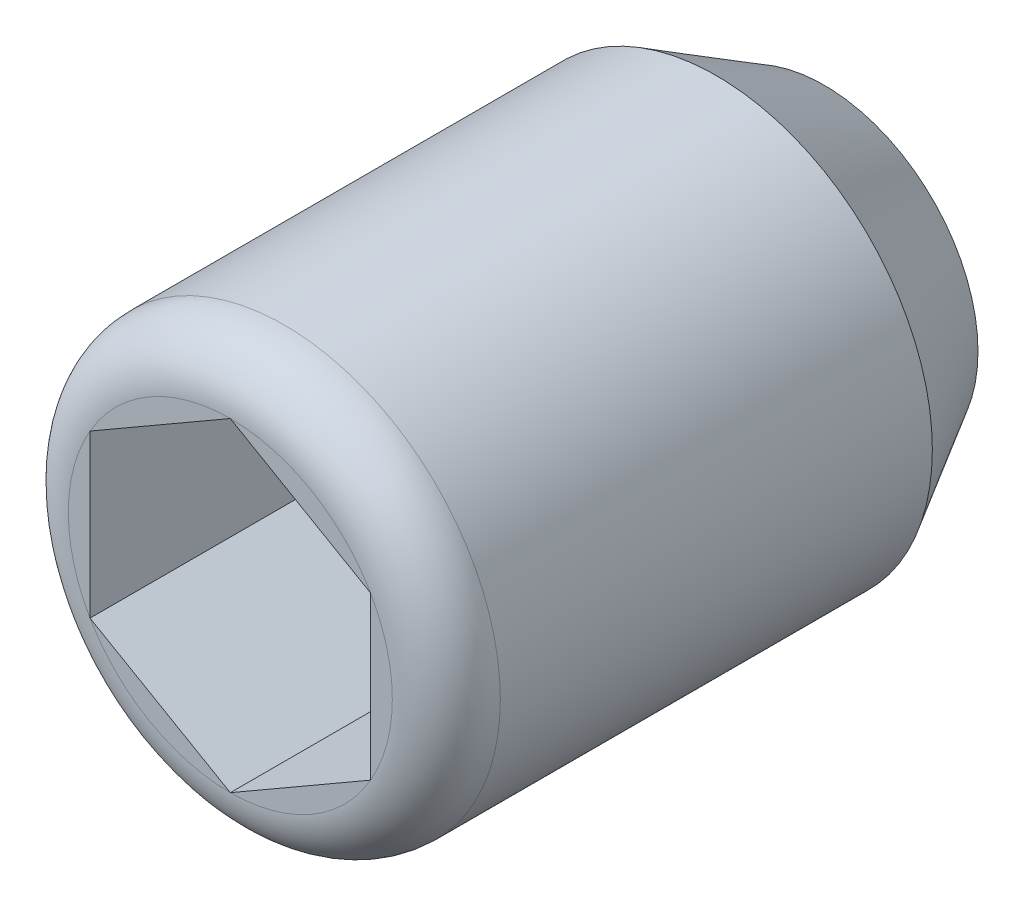
ISO-10303-21;
HEADER;
FILE_DESCRIPTION(('STEP AP214'),'2;1');
FILE_NAME('part.step','',(''),(''),'','','');
FILE_SCHEMA(('AUTOMOTIVE_DESIGN { 1 0 10303 214 1 1 1 1 }'));
ENDSEC;
DATA;
#1=APPLICATION_CONTEXT('core data for automotive mechanical design processes');
#2=APPLICATION_PROTOCOL_DEFINITION('international standard','automotive_design',2000,#1);
#3=PRODUCT_CONTEXT('',#1,'mechanical');
#4=PRODUCT('Part','Part','',(#3));
#5=PRODUCT_RELATED_PRODUCT_CATEGORY('part','',(#4));
#6=PRODUCT_DEFINITION_FORMATION('','',#4);
#7=PRODUCT_DEFINITION_CONTEXT('part definition',#1,'design');
#8=PRODUCT_DEFINITION('design','',#6,#7);
#9=PRODUCT_DEFINITION_SHAPE('','',#8);
#10=(LENGTH_UNIT() NAMED_UNIT(*) SI_UNIT(.MILLI.,.METRE.));
#11=(NAMED_UNIT(*) PLANE_ANGLE_UNIT() SI_UNIT($,.RADIAN.));
#12=(NAMED_UNIT(*) SI_UNIT($,.STERADIAN.) SOLID_ANGLE_UNIT());
#13=UNCERTAINTY_MEASURE_WITH_UNIT(LENGTH_MEASURE(1.E-05),#10,'distance_accuracy_value','');
#14=(GEOMETRIC_REPRESENTATION_CONTEXT(3) GLOBAL_UNCERTAINTY_ASSIGNED_CONTEXT((#13)) GLOBAL_UNIT_ASSIGNED_CONTEXT((#10,
#11,#12)) REPRESENTATION_CONTEXT('',''));
#15=CARTESIAN_POINT('',(0.,0.,0.));
#16=DIRECTION('',(0.,0.,1.));
#17=DIRECTION('',(1.,0.,0.));
#18=AXIS2_PLACEMENT_3D('',#15,#16,#17);
#19=CARTESIAN_POINT('',(0.,0.,5.5));
#20=DIRECTION('',(0.,0.,-1.));
#21=DIRECTION('',(0.,-1.,0.));
#22=AXIS2_PLACEMENT_3D('',#19,#20,#21);
#23=PLANE('',#22);
#24=DIRECTION('',(-0.866025403784439,0.5,0.));
#25=VECTOR('',#24,1.);
#26=CARTESIAN_POINT('',(1.29903810567666,0.75,5.5));
#27=LINE('',#26,#25);
#28=CARTESIAN_POINT('',(1.29903810567666,0.75,5.5));
#29=VERTEX_POINT('',#28);
#30=CARTESIAN_POINT('',(0.,1.5,5.5));
#31=VERTEX_POINT('',#30);
#32=EDGE_CURVE('E40',#29,#31,#27,.T.);
#33=ORIENTED_EDGE('',*,*,#32,.F.);
#34=CARTESIAN_POINT('',(0.,0.,5.5));
#35=DIRECTION('',(0.,0.,1.));
#36=DIRECTION('',(-1.,0.,0.));
#37=AXIS2_PLACEMENT_3D('',#34,#35,#36);
#38=CIRCLE('',#37,1.5);
#39=EDGE_CURVE('E11',#29,#31,#38,.T.);
#40=ORIENTED_EDGE('',*,*,#39,.T.);
#41=EDGE_LOOP('',(#33,#40));
#42=FACE_BOUND('',#41,.T.);
#43=ADVANCED_FACE('F17',(#42),#23,.F.);
#44=CARTESIAN_POINT('',(0.,0.,5.5));
#45=DIRECTION('',(0.,0.,-1.));
#46=DIRECTION('',(0.,-1.,0.));
#47=AXIS2_PLACEMENT_3D('',#44,#45,#46);
#48=PLANE('',#47);
#49=DIRECTION('',(-0.866025403784438,-0.5,0.));
#50=VECTOR('',#49,1.);
#51=CARTESIAN_POINT('',(0.,1.5,5.5));
#52=LINE('',#51,#50);
#53=CARTESIAN_POINT('',(-1.29903810567665,0.75,5.5));
#54=VERTEX_POINT('',#53);
#55=EDGE_CURVE('E141',#31,#54,#52,.T.);
#56=ORIENTED_EDGE('',*,*,#55,.F.);
#57=CARTESIAN_POINT('',(0.,0.,5.5));
#58=DIRECTION('',(0.,0.,1.));
#59=DIRECTION('',(-1.,0.,0.));
#60=AXIS2_PLACEMENT_3D('',#57,#58,#59);
#61=CIRCLE('',#60,1.5);
#62=EDGE_CURVE('E28',#31,#54,#61,.T.);
#63=ORIENTED_EDGE('',*,*,#62,.T.);
#64=EDGE_LOOP('',(#56,#63));
#65=FACE_BOUND('',#64,.T.);
#66=ADVANCED_FACE('F216',(#65),#48,.F.);
#67=CARTESIAN_POINT('',(0.,0.,5.5));
#68=DIRECTION('',(0.,0.,-1.));
#69=DIRECTION('',(0.,-1.,0.));
#70=AXIS2_PLACEMENT_3D('',#67,#68,#69);
#71=PLANE('',#70);
#72=DIRECTION('',(0.,-1.,0.));
#73=VECTOR('',#72,1.);
#74=CARTESIAN_POINT('',(-1.29903810567665,0.75,5.5));
#75=LINE('',#74,#73);
#76=CARTESIAN_POINT('',(-1.29903810567665,-0.75,5.5));
#77=VERTEX_POINT('',#76);
#78=EDGE_CURVE('E142',#54,#77,#75,.T.);
#79=ORIENTED_EDGE('',*,*,#78,.F.);
#80=CARTESIAN_POINT('',(0.,0.,5.5));
#81=DIRECTION('',(0.,0.,1.));
#82=DIRECTION('',(-1.,0.,0.));
#83=AXIS2_PLACEMENT_3D('',#80,#81,#82);
#84=CIRCLE('',#83,1.5);
#85=EDGE_CURVE('E168',#54,#77,#84,.T.);
#86=ORIENTED_EDGE('',*,*,#85,.T.);
#87=EDGE_LOOP('',(#79,#86));
#88=FACE_BOUND('',#87,.T.);
#89=ADVANCED_FACE('F222',(#88),#71,.F.);
#90=CARTESIAN_POINT('',(0.,0.,5.5));
#91=DIRECTION('',(0.,0.,-1.));
#92=DIRECTION('',(0.,-1.,0.));
#93=AXIS2_PLACEMENT_3D('',#90,#91,#92);
#94=PLANE('',#93);
#95=DIRECTION('',(0.866025403784439,-0.5,0.));
#96=VECTOR('',#95,1.);
#97=CARTESIAN_POINT('',(-1.29903810567665,-0.75,5.5));
#98=LINE('',#97,#96);
#99=CARTESIAN_POINT('',(0.,-1.5,5.5));
#100=VERTEX_POINT('',#99);
#101=EDGE_CURVE('E79',#77,#100,#98,.T.);
#102=ORIENTED_EDGE('',*,*,#101,.F.);
#103=CARTESIAN_POINT('',(0.,0.,5.5));
#104=DIRECTION('',(0.,0.,1.));
#105=DIRECTION('',(-1.,0.,0.));
#106=AXIS2_PLACEMENT_3D('',#103,#104,#105);
#107=CIRCLE('',#106,1.5);
#108=EDGE_CURVE('E147',#77,#100,#107,.T.);
#109=ORIENTED_EDGE('',*,*,#108,.T.);
#110=EDGE_LOOP('',(#102,#109));
#111=FACE_BOUND('',#110,.T.);
#112=ADVANCED_FACE('F301',(#111),#94,.F.);
#113=CARTESIAN_POINT('',(0.,0.,5.5));
#114=DIRECTION('',(0.,0.,-1.));
#115=DIRECTION('',(0.,-1.,0.));
#116=AXIS2_PLACEMENT_3D('',#113,#114,#115);
#117=PLANE('',#116);
#118=DIRECTION('',(0.866025403784438,0.5,0.));
#119=VECTOR('',#118,1.);
#120=CARTESIAN_POINT('',(0.,-1.5,5.5));
#121=LINE('',#120,#119);
#122=CARTESIAN_POINT('',(1.29903810567666,-0.75,5.5));
#123=VERTEX_POINT('',#122);
#124=EDGE_CURVE('E120',#100,#123,#121,.T.);
#125=ORIENTED_EDGE('',*,*,#124,.F.);
#126=CARTESIAN_POINT('',(0.,0.,5.5));
#127=DIRECTION('',(0.,0.,1.));
#128=DIRECTION('',(-1.,0.,0.));
#129=AXIS2_PLACEMENT_3D('',#126,#127,#128);
#130=CIRCLE('',#129,1.5);
#131=EDGE_CURVE('E143',#100,#123,#130,.T.);
#132=ORIENTED_EDGE('',*,*,#131,.T.);
#133=EDGE_LOOP('',(#125,#132));
#134=FACE_BOUND('',#133,.T.);
#135=ADVANCED_FACE('F315',(#134),#117,.F.);
#136=CARTESIAN_POINT('',(0.,0.,5.5));
#137=DIRECTION('',(0.,0.,-1.));
#138=DIRECTION('',(-1.,0.,0.));
#139=AXIS2_PLACEMENT_3D('',#136,#137,#138);
#140=CYLINDRICAL_SURFACE('',#139,2.);
#141=CARTESIAN_POINT('',(0.,0.,5.));
#142=DIRECTION('',(0.,0.,-1.));
#143=DIRECTION('',(-1.,0.,0.));
#144=AXIS2_PLACEMENT_3D('',#141,#142,#143);
#145=CIRCLE('',#144,2.);
#146=CARTESIAN_POINT('',(-2.,0.,5.));
#147=VERTEX_POINT('',#146);
#148=EDGE_CURVE('E148',#147,#147,#145,.T.);
#149=ORIENTED_EDGE('',*,*,#148,.T.);
#150=EDGE_LOOP('',(#149));
#151=FACE_BOUND('',#150,.T.);
#152=CARTESIAN_POINT('',(0.,0.,1.));
#153=DIRECTION('',(0.,0.,1.));
#154=DIRECTION('',(-1.,0.,0.));
#155=AXIS2_PLACEMENT_3D('',#152,#153,#154);
#156=CIRCLE('',#155,2.);
#157=CARTESIAN_POINT('',(-2.,0.,1.));
#158=VERTEX_POINT('',#157);
#159=EDGE_CURVE('E173',#158,#158,#156,.T.);
#160=ORIENTED_EDGE('',*,*,#159,.T.);
#161=EDGE_LOOP('',(#160));
#162=FACE_BOUND('',#161,.T.);
#163=ADVANCED_FACE('F310',(#151,#162),#140,.T.);
#164=CARTESIAN_POINT('',(0.,0.,5.5));
#165=DIRECTION('',(0.,0.,-1.));
#166=DIRECTION('',(0.,-1.,0.));
#167=AXIS2_PLACEMENT_3D('',#164,#165,#166);
#168=PLANE('',#167);
#169=DIRECTION('',(0.,1.,0.));
#170=VECTOR('',#169,1.);
#171=CARTESIAN_POINT('',(1.29903810567666,-0.75,5.5));
#172=LINE('',#171,#170);
#173=EDGE_CURVE('E88',#123,#29,#172,.T.);
#174=ORIENTED_EDGE('',*,*,#173,.F.);
#175=CARTESIAN_POINT('',(0.,0.,5.5));
#176=DIRECTION('',(0.,0.,1.));
#177=DIRECTION('',(-1.,0.,0.));
#178=AXIS2_PLACEMENT_3D('',#175,#176,#177);
#179=CIRCLE('',#178,1.5);
#180=EDGE_CURVE('E170',#123,#29,#179,.T.);
#181=ORIENTED_EDGE('',*,*,#180,.T.);
#182=EDGE_LOOP('',(#174,#181));
#183=FACE_BOUND('',#182,.T.);
#184=ADVANCED_FACE('F253',(#183),#168,.F.);
#185=CARTESIAN_POINT('',(0.,0.,0.));
#186=DIRECTION('',(0.,0.,-1.));
#187=DIRECTION('',(0.,-1.,0.));
#188=AXIS2_PLACEMENT_3D('',#185,#186,#187);
#189=PLANE('',#188);
#190=CARTESIAN_POINT('',(0.,0.,0.));
#191=DIRECTION('',(0.,0.,-1.));
#192=DIRECTION('',(-1.,0.,0.));
#193=AXIS2_PLACEMENT_3D('',#190,#191,#192);
#194=CIRCLE('',#193,1.42264973081037);
#195=CARTESIAN_POINT('',(-1.42264973081037,0.,0.));
#196=VERTEX_POINT('',#195);
#197=EDGE_CURVE('E134',#196,#196,#194,.T.);
#198=ORIENTED_EDGE('',*,*,#197,.T.);
#199=EDGE_LOOP('',(#198));
#200=FACE_BOUND('',#199,.T.);
#201=ADVANCED_FACE('F248',(#200),#189,.T.);
#202=CARTESIAN_POINT('',(0.,0.,0.));
#203=DIRECTION('',(0.,0.,1.));
#204=DIRECTION('',(1.,0.,0.));
#205=AXIS2_PLACEMENT_3D('',#202,#203,#204);
#206=CONICAL_SURFACE('',#205,1.42264973081037,0.523598775598299);
#207=ORIENTED_EDGE('',*,*,#159,.F.);
#208=EDGE_LOOP('',(#207));
#209=FACE_BOUND('',#208,.T.);
#210=ORIENTED_EDGE('',*,*,#197,.F.);
#211=EDGE_LOOP('',(#210));
#212=FACE_BOUND('',#211,.T.);
#213=ADVANCED_FACE('F239',(#209,#212),#206,.T.);
#214=CARTESIAN_POINT('',(0.,-1.5,2.5));
#215=DIRECTION('',(0.5,-0.866025403784438,0.));
#216=DIRECTION('',(0.,0.,-1.));
#217=AXIS2_PLACEMENT_3D('',#214,#215,#216);
#218=PLANE('',#217);
#219=ORIENTED_EDGE('',*,*,#124,.T.);
#220=DIRECTION('',(0.,0.,1.));
#221=VECTOR('',#220,1.);
#222=CARTESIAN_POINT('',(1.29903810567666,-0.75,2.5));
#223=LINE('',#222,#221);
#224=CARTESIAN_POINT('',(1.29903810567666,-0.75,2.5));
#225=VERTEX_POINT('',#224);
#226=EDGE_CURVE('E110',#225,#123,#223,.T.);
#227=ORIENTED_EDGE('',*,*,#226,.F.);
#228=DIRECTION('',(0.866025403784438,0.5,0.));
#229=VECTOR('',#228,1.);
#230=CARTESIAN_POINT('',(0.,-1.5,2.5));
#231=LINE('',#230,#229);
#232=CARTESIAN_POINT('',(0.,-1.5,2.5));
#233=VERTEX_POINT('',#232);
#234=EDGE_CURVE('E106',#233,#225,#231,.T.);
#235=ORIENTED_EDGE('',*,*,#234,.F.);
#236=DIRECTION('',(0.,0.,1.));
#237=VECTOR('',#236,1.);
#238=CARTESIAN_POINT('',(0.,-1.5,2.5));
#239=LINE('',#238,#237);
#240=EDGE_CURVE('E108',#233,#100,#239,.T.);
#241=ORIENTED_EDGE('',*,*,#240,.T.);
#242=EDGE_LOOP('',(#219,#227,#235,#241));
#243=FACE_BOUND('',#242,.T.);
#244=ADVANCED_FACE('F107',(#243),#218,.F.);
#245=CARTESIAN_POINT('',(1.29903810567666,-0.75,2.5));
#246=DIRECTION('',(1.,0.,0.));
#247=DIRECTION('',(0.,1.,0.));
#248=AXIS2_PLACEMENT_3D('',#245,#246,#247);
#249=PLANE('',#248);
#250=ORIENTED_EDGE('',*,*,#173,.T.);
#251=DIRECTION('',(0.,0.,1.));
#252=VECTOR('',#251,1.);
#253=CARTESIAN_POINT('',(1.29903810567666,0.75,2.5));
#254=LINE('',#253,#252);
#255=CARTESIAN_POINT('',(1.29903810567666,0.75,2.5));
#256=VERTEX_POINT('',#255);
#257=EDGE_CURVE('E183',#256,#29,#254,.T.);
#258=ORIENTED_EDGE('',*,*,#257,.F.);
#259=DIRECTION('',(0.,1.,0.));
#260=VECTOR('',#259,1.);
#261=CARTESIAN_POINT('',(1.29903810567666,-0.75,2.5));
#262=LINE('',#261,#260);
#263=EDGE_CURVE('E115',#225,#256,#262,.T.);
#264=ORIENTED_EDGE('',*,*,#263,.F.);
#265=ORIENTED_EDGE('',*,*,#226,.T.);
#266=EDGE_LOOP('',(#250,#258,#264,#265));
#267=FACE_BOUND('',#266,.T.);
#268=ADVANCED_FACE('F238',(#267),#249,.F.);
#269=CARTESIAN_POINT('',(1.29903810567666,0.75,2.5));
#270=DIRECTION('',(0.5,0.866025403784439,0.));
#271=DIRECTION('',(0.,0.,-1.));
#272=AXIS2_PLACEMENT_3D('',#269,#270,#271);
#273=PLANE('',#272);
#274=ORIENTED_EDGE('',*,*,#32,.T.);
#275=DIRECTION('',(0.,0.,1.));
#276=VECTOR('',#275,1.);
#277=CARTESIAN_POINT('',(0.,1.5,2.5));
#278=LINE('',#277,#276);
#279=CARTESIAN_POINT('',(0.,1.5,2.5));
#280=VERTEX_POINT('',#279);
#281=EDGE_CURVE('E137',#280,#31,#278,.T.);
#282=ORIENTED_EDGE('',*,*,#281,.F.);
#283=DIRECTION('',(-0.866025403784439,0.5,0.));
#284=VECTOR('',#283,1.);
#285=CARTESIAN_POINT('',(1.29903810567666,0.75,2.5));
#286=LINE('',#285,#284);
#287=EDGE_CURVE('E165',#256,#280,#286,.T.);
#288=ORIENTED_EDGE('',*,*,#287,.F.);
#289=ORIENTED_EDGE('',*,*,#257,.T.);
#290=EDGE_LOOP('',(#274,#282,#288,#289));
#291=FACE_BOUND('',#290,.T.);
#292=ADVANCED_FACE('F265',(#291),#273,.F.);
#293=CARTESIAN_POINT('',(0.,1.5,2.5));
#294=DIRECTION('',(-0.5,0.866025403784438,0.));
#295=DIRECTION('',(0.,0.,1.));
#296=AXIS2_PLACEMENT_3D('',#293,#294,#295);
#297=PLANE('',#296);
#298=ORIENTED_EDGE('',*,*,#55,.T.);
#299=DIRECTION('',(0.,0.,1.));
#300=VECTOR('',#299,1.);
#301=CARTESIAN_POINT('',(-1.29903810567665,0.75,2.5));
#302=LINE('',#301,#300);
#303=CARTESIAN_POINT('',(-1.29903810567665,0.75,2.5));
#304=VERTEX_POINT('',#303);
#305=EDGE_CURVE('E150',#304,#54,#302,.T.);
#306=ORIENTED_EDGE('',*,*,#305,.F.);
#307=DIRECTION('',(-0.866025403784438,-0.5,0.));
#308=VECTOR('',#307,1.);
#309=CARTESIAN_POINT('',(0.,1.5,2.5));
#310=LINE('',#309,#308);
#311=EDGE_CURVE('E131',#280,#304,#310,.T.);
#312=ORIENTED_EDGE('',*,*,#311,.F.);
#313=ORIENTED_EDGE('',*,*,#281,.T.);
#314=EDGE_LOOP('',(#298,#306,#312,#313));
#315=FACE_BOUND('',#314,.T.);
#316=ADVANCED_FACE('F209',(#315),#297,.F.);
#317=CARTESIAN_POINT('',(-1.29903810567665,0.75,2.5));
#318=DIRECTION('',(-1.,0.,0.));
#319=DIRECTION('',(0.,1.,0.));
#320=AXIS2_PLACEMENT_3D('',#317,#318,#319);
#321=PLANE('',#320);
#322=ORIENTED_EDGE('',*,*,#78,.T.);
#323=DIRECTION('',(0.,0.,1.));
#324=VECTOR('',#323,1.);
#325=CARTESIAN_POINT('',(-1.29903810567665,-0.75,2.5));
#326=LINE('',#325,#324);
#327=CARTESIAN_POINT('',(-1.29903810567665,-0.75,2.5));
#328=VERTEX_POINT('',#327);
#329=EDGE_CURVE('E21',#328,#77,#326,.T.);
#330=ORIENTED_EDGE('',*,*,#329,.F.);
#331=DIRECTION('',(0.,-1.,0.));
#332=VECTOR('',#331,1.);
#333=CARTESIAN_POINT('',(-1.29903810567665,0.75,2.5));
#334=LINE('',#333,#332);
#335=EDGE_CURVE('E124',#304,#328,#334,.T.);
#336=ORIENTED_EDGE('',*,*,#335,.F.);
#337=ORIENTED_EDGE('',*,*,#305,.T.);
#338=EDGE_LOOP('',(#322,#330,#336,#337));
#339=FACE_BOUND('',#338,.T.);
#340=ADVANCED_FACE('F211',(#339),#321,.F.);
#341=CARTESIAN_POINT('',(-1.29903810567665,-0.75,2.5));
#342=DIRECTION('',(-0.5,-0.866025403784439,0.));
#343=DIRECTION('',(-0.866025403784439,0.5,0.));
#344=AXIS2_PLACEMENT_3D('',#341,#342,#343);
#345=PLANE('',#344);
#346=ORIENTED_EDGE('',*,*,#101,.T.);
#347=ORIENTED_EDGE('',*,*,#240,.F.);
#348=DIRECTION('',(0.866025403784439,-0.5,0.));
#349=VECTOR('',#348,1.);
#350=CARTESIAN_POINT('',(-1.29903810567665,-0.75,2.5));
#351=LINE('',#350,#349);
#352=EDGE_CURVE('E118',#328,#233,#351,.T.);
#353=ORIENTED_EDGE('',*,*,#352,.F.);
#354=ORIENTED_EDGE('',*,*,#329,.T.);
#355=EDGE_LOOP('',(#346,#347,#353,#354));
#356=FACE_BOUND('',#355,.T.);
#357=ADVANCED_FACE('F19',(#356),#345,.F.);
#358=CARTESIAN_POINT('',(0.,0.,2.5));
#359=DIRECTION('',(0.,0.,1.));
#360=DIRECTION('',(1.,0.,0.));
#361=AXIS2_PLACEMENT_3D('',#358,#359,#360);
#362=PLANE('',#361);
#363=ORIENTED_EDGE('',*,*,#234,.T.);
#364=ORIENTED_EDGE('',*,*,#263,.T.);
#365=ORIENTED_EDGE('',*,*,#287,.T.);
#366=ORIENTED_EDGE('',*,*,#311,.T.);
#367=ORIENTED_EDGE('',*,*,#335,.T.);
#368=ORIENTED_EDGE('',*,*,#352,.T.);
#369=EDGE_LOOP('',(#363,#364,#365,#366,#367,#368));
#370=FACE_BOUND('',#369,.T.);
#371=ADVANCED_FACE('F122',(#370),#362,.T.);
#372=CARTESIAN_POINT('',(0.,0.,5.));
#373=DIRECTION('',(0.,0.,-1.));
#374=DIRECTION('',(-1.,0.,0.));
#375=AXIS2_PLACEMENT_3D('',#372,#373,#374);
#376=TOROIDAL_SURFACE('',#375,1.5,0.5);
#377=ORIENTED_EDGE('',*,*,#62,.F.);
#378=ORIENTED_EDGE('',*,*,#39,.F.);
#379=ORIENTED_EDGE('',*,*,#180,.F.);
#380=ORIENTED_EDGE('',*,*,#131,.F.);
#381=ORIENTED_EDGE('',*,*,#108,.F.);
#382=ORIENTED_EDGE('',*,*,#85,.F.);
#383=EDGE_LOOP('',(#377,#378,#379,#380,#381,#382));
#384=FACE_BOUND('',#383,.T.);
#385=ORIENTED_EDGE('',*,*,#148,.F.);
#386=EDGE_LOOP('',(#385));
#387=FACE_BOUND('',#386,.T.);
#388=ADVANCED_FACE('F274',(#384,#387),#376,.T.);
#389=CLOSED_SHELL('',(#43,#66,#89,#112,#135,#163,#184,#201,#213,#244,#268,#292,#316,#340,#357,
#371,#388));
#390=MANIFOLD_SOLID_BREP('B1',#389);
#391=ADVANCED_BREP_SHAPE_REPRESENTATION('',(#18,#390),#14);
#392=SHAPE_DEFINITION_REPRESENTATION(#9,#391);
ENDSEC;
END-ISO-10303-21;
